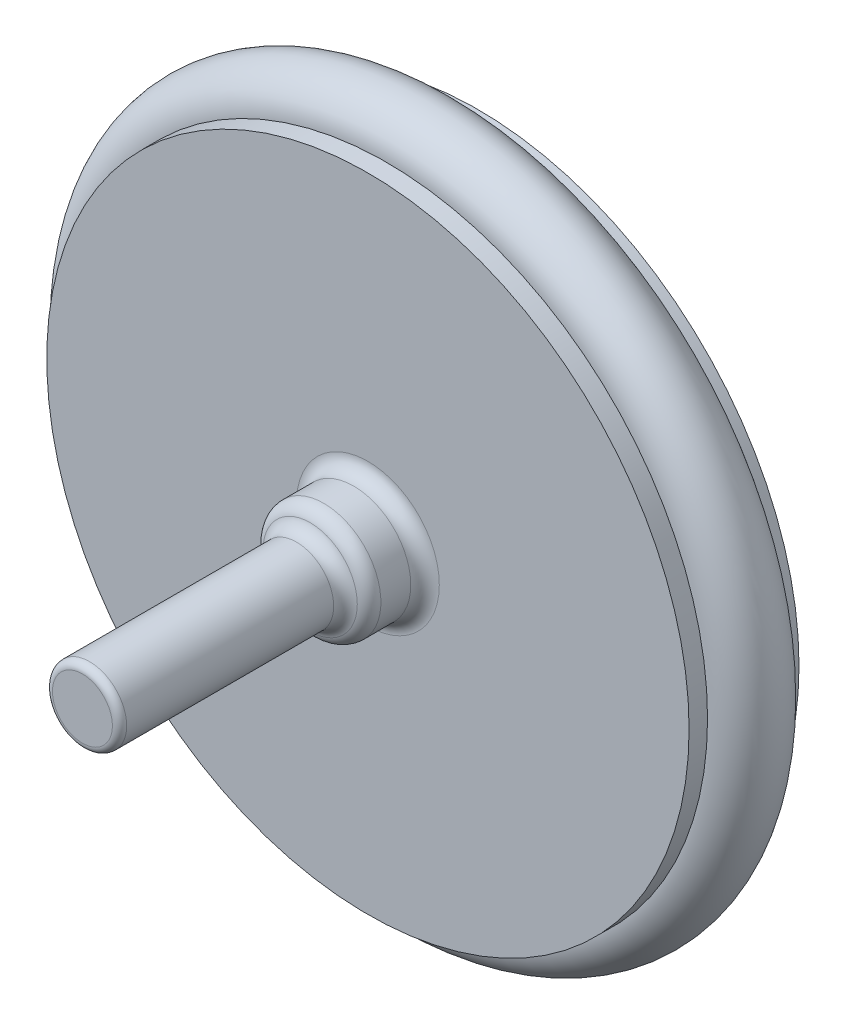
ISO-10303-21;
HEADER;
FILE_DESCRIPTION(('STEP AP214'),'2;1');
FILE_NAME('part.step','',(''),(''),'','','');
FILE_SCHEMA(('AUTOMOTIVE_DESIGN { 1 0 10303 214 1 1 1 1 }'));
ENDSEC;
DATA;
#1=APPLICATION_CONTEXT('core data for automotive mechanical design processes');
#2=APPLICATION_PROTOCOL_DEFINITION('international standard','automotive_design',2000,#1);
#3=PRODUCT_CONTEXT('',#1,'mechanical');
#4=PRODUCT('Part','Part','',(#3));
#5=PRODUCT_RELATED_PRODUCT_CATEGORY('part','',(#4));
#6=PRODUCT_DEFINITION_FORMATION('','',#4);
#7=PRODUCT_DEFINITION_CONTEXT('part definition',#1,'design');
#8=PRODUCT_DEFINITION('design','',#6,#7);
#9=PRODUCT_DEFINITION_SHAPE('','',#8);
#10=(LENGTH_UNIT() NAMED_UNIT(*) SI_UNIT(.MILLI.,.METRE.));
#11=(NAMED_UNIT(*) PLANE_ANGLE_UNIT() SI_UNIT($,.RADIAN.));
#12=(NAMED_UNIT(*) SI_UNIT($,.STERADIAN.) SOLID_ANGLE_UNIT());
#13=UNCERTAINTY_MEASURE_WITH_UNIT(LENGTH_MEASURE(1.E-05),#10,'distance_accuracy_value','');
#14=(GEOMETRIC_REPRESENTATION_CONTEXT(3) GLOBAL_UNCERTAINTY_ASSIGNED_CONTEXT((#13)) GLOBAL_UNIT_ASSIGNED_CONTEXT((#10,
#11,#12)) REPRESENTATION_CONTEXT('',''));
#15=CARTESIAN_POINT('',(0.,0.,0.));
#16=DIRECTION('',(0.,0.,1.));
#17=DIRECTION('',(1.,0.,0.));
#18=AXIS2_PLACEMENT_3D('',#15,#16,#17);
#19=CARTESIAN_POINT('',(0.,0.,0.));
#20=DIRECTION('',(0.,0.,-1.));
#21=DIRECTION('',(-1.,0.,0.));
#22=AXIS2_PLACEMENT_3D('',#19,#20,#21);
#23=TOROIDAL_SURFACE('',#22,22.5,2.56123692555145);
#24=CARTESIAN_POINT('',(22.5,0.,0.));
#25=DIRECTION('',(0.,1.,0.));
#26=DIRECTION('',(0.,0.,1.));
#27=AXIS2_PLACEMENT_3D('',#24,#25,#26);
#28=CIRCLE('',#27,2.56123692555145);
#29=CARTESIAN_POINT('',(25.0612369255515,0.,0.));
#30=VERTEX_POINT('',#29);
#31=EDGE_CURVE('E11',#30,#30,#28,.T.);
#32=CARTESIAN_POINT('',(0.,0.,0.));
#33=DIRECTION('',(0.,0.,-1.));
#34=DIRECTION('',(-1.,0.,0.));
#35=AXIS2_PLACEMENT_3D('',#32,#33,#34);
#36=CIRCLE('',#35,25.0612369255515);
#37=EDGE_CURVE('',#30,#30,#36,.T.);
#38=ORIENTED_EDGE('',*,*,#31,.F.);
#39=ORIENTED_EDGE('',*,*,#31,.T.);
#40=ORIENTED_EDGE('',*,*,#37,.T.);
#41=ORIENTED_EDGE('',*,*,#37,.F.);
#42=EDGE_LOOP('',(#38,#40,#39,#41));
#43=FACE_BOUND('',#42,.T.);
#44=ADVANCED_FACE('F51',(#43),#23,.T.);
#45=CLOSED_SHELL('',(#44));
#46=MANIFOLD_SOLID_BREP('B2',#45);
#47=CARTESIAN_POINT('',(0.,0.,3.85));
#48=DIRECTION('',(0.,0.,-1.));
#49=DIRECTION('',(-1.,0.,0.));
#50=AXIS2_PLACEMENT_3D('',#47,#48,#49);
#51=CYLINDRICAL_SURFACE('',#50,22.5);
#52=CARTESIAN_POINT('',(0.,0.,2.55));
#53=DIRECTION('',(0.,0.,-1.));
#54=DIRECTION('',(-1.,0.,0.));
#55=AXIS2_PLACEMENT_3D('',#52,#53,#54);
#56=CIRCLE('',#55,22.5);
#57=CARTESIAN_POINT('',(22.5,0.,2.55));
#58=VERTEX_POINT('',#57);
#59=EDGE_CURVE('E91',#58,#58,#56,.F.);
#60=ORIENTED_EDGE('',*,*,#59,.T.);
#61=EDGE_LOOP('',(#60));
#62=FACE_BOUND('',#61,.T.);
#63=CARTESIAN_POINT('',(0.,0.,3.85));
#64=DIRECTION('',(0.,0.,1.));
#65=DIRECTION('',(1.,0.,0.));
#66=AXIS2_PLACEMENT_3D('',#63,#64,#65);
#67=CIRCLE('',#66,22.5);
#68=CARTESIAN_POINT('',(22.5,0.,3.85));
#69=VERTEX_POINT('',#68);
#70=EDGE_CURVE('E97',#69,#69,#67,.T.);
#71=ORIENTED_EDGE('',*,*,#70,.F.);
#72=EDGE_LOOP('',(#71));
#73=FACE_BOUND('',#72,.T.);
#74=ADVANCED_FACE('F70',(#62,#73),#51,.T.);
#75=CARTESIAN_POINT('',(0.,0.,3.85));
#76=DIRECTION('',(0.,0.,1.));
#77=DIRECTION('',(1.,0.,0.));
#78=AXIS2_PLACEMENT_3D('',#75,#76,#77);
#79=PLANE('',#78);
#80=CARTESIAN_POINT('',(0.,0.,3.85));
#81=DIRECTION('',(0.,0.,1.));
#82=DIRECTION('',(1.,0.,0.));
#83=AXIS2_PLACEMENT_3D('',#80,#81,#82);
#84=CIRCLE('',#83,5.);
#85=CARTESIAN_POINT('',(5.,0.,3.85));
#86=VERTEX_POINT('',#85);
#87=EDGE_CURVE('E111',#86,#86,#84,.F.);
#88=ORIENTED_EDGE('',*,*,#87,.T.);
#89=EDGE_LOOP('',(#88));
#90=FACE_BOUND('',#89,.T.);
#91=ORIENTED_EDGE('',*,*,#70,.T.);
#92=EDGE_LOOP('',(#91));
#93=FACE_BOUND('',#92,.T.);
#94=ADVANCED_FACE('F142',(#90,#93),#79,.T.);
#95=CARTESIAN_POINT('',(0.,0.,0.));
#96=DIRECTION('',(0.,0.,1.));
#97=DIRECTION('',(1.,0.,0.));
#98=AXIS2_PLACEMENT_3D('',#95,#96,#97);
#99=TOROIDAL_SURFACE('',#98,22.5,2.55);
#100=CARTESIAN_POINT('',(22.5,0.,0.));
#101=DIRECTION('',(0.,1.,0.));
#102=DIRECTION('',(0.,0.,1.));
#103=AXIS2_PLACEMENT_3D('',#100,#101,#102);
#104=CIRCLE('',#103,2.55);
#105=CARTESIAN_POINT('',(22.5,0.,-2.55));
#106=VERTEX_POINT('',#105);
#107=EDGE_CURVE('E86',#106,#58,#104,.T.);
#108=ORIENTED_EDGE('',*,*,#107,.F.);
#109=CARTESIAN_POINT('',(0.,0.,-2.55));
#110=DIRECTION('',(0.,0.,1.));
#111=DIRECTION('',(1.,0.,0.));
#112=AXIS2_PLACEMENT_3D('',#109,#110,#111);
#113=CIRCLE('',#112,22.5);
#114=EDGE_CURVE('E89',#106,#106,#113,.F.);
#115=ORIENTED_EDGE('',*,*,#114,.F.);
#116=ORIENTED_EDGE('',*,*,#107,.T.);
#117=ORIENTED_EDGE('',*,*,#59,.F.);
#118=EDGE_LOOP('',(#108,#115,#116,#117));
#119=FACE_BOUND('',#118,.T.);
#120=ADVANCED_FACE('F87',(#119),#99,.F.);
#121=CARTESIAN_POINT('',(0.,0.,-3.85));
#122=DIRECTION('',(0.,0.,1.));
#123=DIRECTION('',(1.,0.,0.));
#124=AXIS2_PLACEMENT_3D('',#121,#122,#123);
#125=PLANE('',#124);
#126=CARTESIAN_POINT('',(0.,0.,-3.85));
#127=DIRECTION('',(0.,0.,1.));
#128=DIRECTION('',(1.,0.,0.));
#129=AXIS2_PLACEMENT_3D('',#126,#127,#128);
#130=CIRCLE('',#129,22.5);
#131=CARTESIAN_POINT('',(22.5,0.,-3.85));
#132=VERTEX_POINT('',#131);
#133=EDGE_CURVE('E93',#132,#132,#130,.T.);
#134=ORIENTED_EDGE('',*,*,#133,.F.);
#135=EDGE_LOOP('',(#134));
#136=FACE_BOUND('',#135,.T.);
#137=ADVANCED_FACE('F156',(#136),#125,.F.);
#138=ORIENTED_EDGE('',*,*,#114,.T.);
#139=EDGE_LOOP('',(#138));
#140=FACE_BOUND('',#139,.T.);
#141=ORIENTED_EDGE('',*,*,#133,.T.);
#142=EDGE_LOOP('',(#141));
#143=FACE_BOUND('',#142,.T.);
#144=ADVANCED_FACE('F145',(#140,#143),#51,.T.);
#145=CARTESIAN_POINT('',(0.,0.,7.85));
#146=DIRECTION('',(0.,0.,-1.));
#147=DIRECTION('',(-1.,0.,0.));
#148=AXIS2_PLACEMENT_3D('',#145,#146,#147);
#149=CYLINDRICAL_SURFACE('',#148,4.);
#150=CARTESIAN_POINT('',(0.,0.,6.94212159716611));
#151=DIRECTION('',(0.,0.,-1.));
#152=DIRECTION('',(-1.,0.,0.));
#153=AXIS2_PLACEMENT_3D('',#150,#151,#152);
#154=CIRCLE('',#153,4.);
#155=CARTESIAN_POINT('',(-4.,0.,6.94212159716611));
#156=VERTEX_POINT('',#155);
#157=EDGE_CURVE('E123',#156,#156,#154,.T.);
#158=ORIENTED_EDGE('',*,*,#157,.T.);
#159=EDGE_LOOP('',(#158));
#160=FACE_BOUND('',#159,.T.);
#161=CARTESIAN_POINT('',(0.,0.,4.85));
#162=DIRECTION('',(0.,0.,1.));
#163=DIRECTION('',(1.,0.,0.));
#164=AXIS2_PLACEMENT_3D('',#161,#162,#163);
#165=CIRCLE('',#164,4.);
#166=CARTESIAN_POINT('',(4.,0.,4.85));
#167=VERTEX_POINT('',#166);
#168=EDGE_CURVE('E107',#167,#167,#165,.T.);
#169=ORIENTED_EDGE('',*,*,#168,.T.);
#170=EDGE_LOOP('',(#169));
#171=FACE_BOUND('',#170,.T.);
#172=ADVANCED_FACE('F155',(#160,#171),#149,.T.);
#173=CARTESIAN_POINT('',(0.,0.,4.85));
#174=DIRECTION('',(0.,0.,1.));
#175=DIRECTION('',(1.,0.,0.));
#176=AXIS2_PLACEMENT_3D('',#173,#174,#175);
#177=TOROIDAL_SURFACE('',#176,5.,1.);
#178=ORIENTED_EDGE('',*,*,#87,.F.);
#179=EDGE_LOOP('',(#178));
#180=FACE_BOUND('',#179,.T.);
#181=ORIENTED_EDGE('',*,*,#168,.F.);
#182=EDGE_LOOP('',(#181));
#183=FACE_BOUND('',#182,.T.);
#184=ADVANCED_FACE('F162',(#180,#183),#177,.F.);
#185=CARTESIAN_POINT('',(0.,0.,23.85));
#186=DIRECTION('',(0.,0.,-1.));
#187=DIRECTION('',(-1.,0.,0.));
#188=AXIS2_PLACEMENT_3D('',#185,#186,#187);
#189=CYLINDRICAL_SURFACE('',#188,2.6);
#190=CARTESIAN_POINT('',(0.,0.,23.35));
#191=DIRECTION('',(0.,0.,1.));
#192=DIRECTION('',(1.,0.,0.));
#193=AXIS2_PLACEMENT_3D('',#190,#191,#192);
#194=CIRCLE('',#193,2.6);
#195=CARTESIAN_POINT('',(2.6,0.,23.35));
#196=VERTEX_POINT('',#195);
#197=EDGE_CURVE('E49',#196,#196,#194,.F.);
#198=ORIENTED_EDGE('',*,*,#197,.T.);
#199=EDGE_LOOP('',(#198));
#200=FACE_BOUND('',#199,.T.);
#201=CARTESIAN_POINT('',(0.,0.,8.85));
#202=DIRECTION('',(0.,0.,1.));
#203=DIRECTION('',(1.,0.,0.));
#204=AXIS2_PLACEMENT_3D('',#201,#202,#203);
#205=CIRCLE('',#204,2.6);
#206=CARTESIAN_POINT('',(2.6,0.,8.85));
#207=VERTEX_POINT('',#206);
#208=EDGE_CURVE('E115',#207,#207,#205,.T.);
#209=ORIENTED_EDGE('',*,*,#208,.T.);
#210=EDGE_LOOP('',(#209));
#211=FACE_BOUND('',#210,.T.);
#212=ADVANCED_FACE('F173',(#200,#211),#189,.T.);
#213=CARTESIAN_POINT('',(0.,0.,23.85));
#214=DIRECTION('',(0.,0.,1.));
#215=DIRECTION('',(1.,0.,0.));
#216=AXIS2_PLACEMENT_3D('',#213,#214,#215);
#217=PLANE('',#216);
#218=CARTESIAN_POINT('',(0.,0.,23.85));
#219=DIRECTION('',(0.,0.,1.));
#220=DIRECTION('',(1.,0.,0.));
#221=AXIS2_PLACEMENT_3D('',#218,#219,#220);
#222=CIRCLE('',#221,2.1);
#223=CARTESIAN_POINT('',(2.1,0.,23.85));
#224=VERTEX_POINT('',#223);
#225=EDGE_CURVE('E79',#224,#224,#222,.T.);
#226=ORIENTED_EDGE('',*,*,#225,.T.);
#227=EDGE_LOOP('',(#226));
#228=FACE_BOUND('',#227,.T.);
#229=ADVANCED_FACE('F130',(#228),#217,.T.);
#230=CARTESIAN_POINT('',(0.,0.,8.85));
#231=DIRECTION('',(0.,0.,1.));
#232=DIRECTION('',(1.,0.,0.));
#233=AXIS2_PLACEMENT_3D('',#230,#231,#232);
#234=TOROIDAL_SURFACE('',#233,3.6,1.);
#235=CARTESIAN_POINT('',(0.,0.,7.89606079858304));
#236=DIRECTION('',(0.,0.,1.));
#237=DIRECTION('',(1.,0.,0.));
#238=AXIS2_PLACEMENT_3D('',#235,#236,#237);
#239=CIRCLE('',#238,3.3);
#240=CARTESIAN_POINT('',(3.3,0.,7.89606079858304));
#241=VERTEX_POINT('',#240);
#242=EDGE_CURVE('E119',#241,#241,#239,.T.);
#243=ORIENTED_EDGE('',*,*,#242,.T.);
#244=EDGE_LOOP('',(#243));
#245=FACE_BOUND('',#244,.T.);
#246=ORIENTED_EDGE('',*,*,#208,.F.);
#247=EDGE_LOOP('',(#246));
#248=FACE_BOUND('',#247,.T.);
#249=ADVANCED_FACE('F138',(#245,#248),#234,.F.);
#250=CARTESIAN_POINT('',(0.,0.,6.94212159716611));
#251=DIRECTION('',(0.,0.,-1.));
#252=DIRECTION('',(-1.,0.,0.));
#253=AXIS2_PLACEMENT_3D('',#250,#251,#252);
#254=TOROIDAL_SURFACE('',#253,3.,1.);
#255=ORIENTED_EDGE('',*,*,#157,.F.);
#256=EDGE_LOOP('',(#255));
#257=FACE_BOUND('',#256,.T.);
#258=ORIENTED_EDGE('',*,*,#242,.F.);
#259=EDGE_LOOP('',(#258));
#260=FACE_BOUND('',#259,.T.);
#261=ADVANCED_FACE('F133',(#257,#260),#254,.T.);
#262=CARTESIAN_POINT('',(0.,0.,23.35));
#263=DIRECTION('',(0.,0.,1.));
#264=DIRECTION('',(1.,0.,0.));
#265=AXIS2_PLACEMENT_3D('',#262,#263,#264);
#266=TOROIDAL_SURFACE('',#265,2.1,0.5);
#267=ORIENTED_EDGE('',*,*,#197,.F.);
#268=EDGE_LOOP('',(#267));
#269=FACE_BOUND('',#268,.T.);
#270=ORIENTED_EDGE('',*,*,#225,.F.);
#271=EDGE_LOOP('',(#270));
#272=FACE_BOUND('',#271,.T.);
#273=ADVANCED_FACE('F72',(#269,#272),#266,.T.);
#274=CLOSED_SHELL('',(#74,#94,#120,#137,#144,#172,#184,#212,#229,#249,#261,#273));
#275=MANIFOLD_SOLID_BREP('B6',#274);
#276=ADVANCED_BREP_SHAPE_REPRESENTATION('',(#18,#46,#275),#14);
#277=SHAPE_DEFINITION_REPRESENTATION(#9,#276);
ENDSEC;
END-ISO-10303-21;
